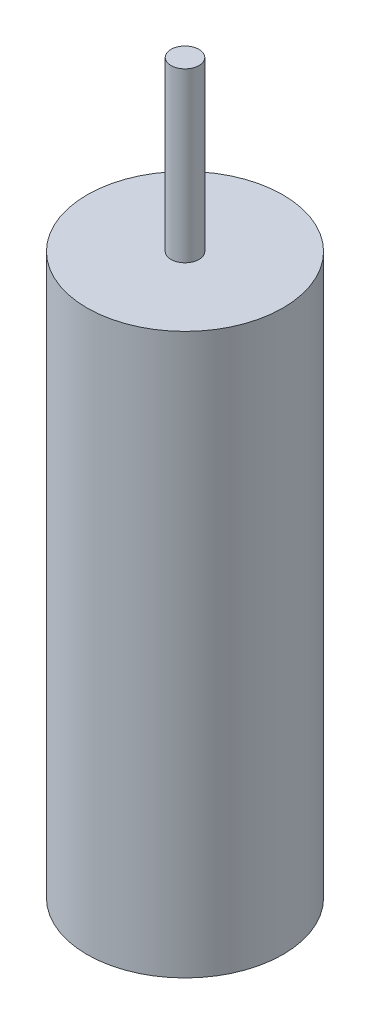
ISO-10303-21;
HEADER;
FILE_DESCRIPTION(('STEP AP214'),'2;1');
FILE_NAME('part.step','',(''),(''),'','','');
FILE_SCHEMA(('AUTOMOTIVE_DESIGN { 1 0 10303 214 1 1 1 1 }'));
ENDSEC;
DATA;
#1=APPLICATION_CONTEXT('core data for automotive mechanical design processes');
#2=APPLICATION_PROTOCOL_DEFINITION('international standard','automotive_design',2000,#1);
#3=PRODUCT_CONTEXT('',#1,'mechanical');
#4=PRODUCT('Part','Part','',(#3));
#5=PRODUCT_RELATED_PRODUCT_CATEGORY('part','',(#4));
#6=PRODUCT_DEFINITION_FORMATION('','',#4);
#7=PRODUCT_DEFINITION_CONTEXT('part definition',#1,'design');
#8=PRODUCT_DEFINITION('design','',#6,#7);
#9=PRODUCT_DEFINITION_SHAPE('','',#8);
#10=(LENGTH_UNIT() NAMED_UNIT(*) SI_UNIT(.MILLI.,.METRE.));
#11=(NAMED_UNIT(*) PLANE_ANGLE_UNIT() SI_UNIT($,.RADIAN.));
#12=(NAMED_UNIT(*) SI_UNIT($,.STERADIAN.) SOLID_ANGLE_UNIT());
#13=UNCERTAINTY_MEASURE_WITH_UNIT(LENGTH_MEASURE(1.E-05),#10,'distance_accuracy_value','');
#14=(GEOMETRIC_REPRESENTATION_CONTEXT(3) GLOBAL_UNCERTAINTY_ASSIGNED_CONTEXT((#13)) GLOBAL_UNIT_ASSIGNED_CONTEXT((#10,
#11,#12)) REPRESENTATION_CONTEXT('',''));
#15=CARTESIAN_POINT('',(0.,0.,0.));
#16=DIRECTION('',(0.,0.,1.));
#17=DIRECTION('',(1.,0.,0.));
#18=AXIS2_PLACEMENT_3D('',#15,#16,#17);
#19=CARTESIAN_POINT('',(0.,20.,0.));
#20=DIRECTION('',(0.,-1.,0.));
#21=DIRECTION('',(0.,0.,-1.));
#22=AXIS2_PLACEMENT_3D('',#19,#20,#21);
#23=CYLINDRICAL_SURFACE('',#22,3.5);
#24=CARTESIAN_POINT('',(0.,20.,0.));
#25=DIRECTION('',(0.,1.,0.));
#26=DIRECTION('',(0.,0.,1.));
#27=AXIS2_PLACEMENT_3D('',#24,#25,#26);
#28=CIRCLE('',#27,3.5);
#29=CARTESIAN_POINT('',(0.,20.,3.5));
#30=VERTEX_POINT('',#29);
#31=EDGE_CURVE('E10',#30,#30,#28,.T.);
#32=ORIENTED_EDGE('',*,*,#31,.F.);
#33=EDGE_LOOP('',(#32));
#34=FACE_BOUND('',#33,.T.);
#35=CARTESIAN_POINT('',(0.,0.,0.));
#36=DIRECTION('',(0.,1.,0.));
#37=DIRECTION('',(0.,0.,1.));
#38=AXIS2_PLACEMENT_3D('',#35,#36,#37);
#39=CIRCLE('',#38,3.5);
#40=CARTESIAN_POINT('',(0.,0.,3.5));
#41=VERTEX_POINT('',#40);
#42=EDGE_CURVE('E34',#41,#41,#39,.T.);
#43=ORIENTED_EDGE('',*,*,#42,.T.);
#44=EDGE_LOOP('',(#43));
#45=FACE_BOUND('',#44,.T.);
#46=ADVANCED_FACE('F31',(#34,#45),#23,.T.);
#47=CARTESIAN_POINT('',(0.,20.,0.));
#48=DIRECTION('',(0.,1.,0.));
#49=DIRECTION('',(0.,0.,1.));
#50=AXIS2_PLACEMENT_3D('',#47,#48,#49);
#51=PLANE('',#50);
#52=CARTESIAN_POINT('',(0.,20.,0.));
#53=DIRECTION('',(0.,1.,0.));
#54=DIRECTION('',(0.,0.,1.));
#55=AXIS2_PLACEMENT_3D('',#52,#53,#54);
#56=CIRCLE('',#55,0.5);
#57=CARTESIAN_POINT('',(0.,20.,0.5));
#58=VERTEX_POINT('',#57);
#59=EDGE_CURVE('E43',#58,#58,#56,.T.);
#60=ORIENTED_EDGE('',*,*,#59,.F.);
#61=EDGE_LOOP('',(#60));
#62=FACE_BOUND('',#61,.T.);
#63=ORIENTED_EDGE('',*,*,#31,.T.);
#64=EDGE_LOOP('',(#63));
#65=FACE_BOUND('',#64,.T.);
#66=ADVANCED_FACE('F58',(#62,#65),#51,.T.);
#67=CARTESIAN_POINT('',(0.,0.,0.));
#68=DIRECTION('',(0.,1.,0.));
#69=DIRECTION('',(0.,0.,1.));
#70=AXIS2_PLACEMENT_3D('',#67,#68,#69);
#71=PLANE('',#70);
#72=ORIENTED_EDGE('',*,*,#42,.F.);
#73=EDGE_LOOP('',(#72));
#74=FACE_BOUND('',#73,.T.);
#75=ADVANCED_FACE('F54',(#74),#71,.F.);
#76=CARTESIAN_POINT('',(0.,26.,0.));
#77=DIRECTION('',(0.,-1.,0.));
#78=DIRECTION('',(0.,0.,-1.));
#79=AXIS2_PLACEMENT_3D('',#76,#77,#78);
#80=CYLINDRICAL_SURFACE('',#79,0.5);
#81=CARTESIAN_POINT('',(0.,26.,0.));
#82=DIRECTION('',(0.,1.,0.));
#83=DIRECTION('',(0.,0.,1.));
#84=AXIS2_PLACEMENT_3D('',#81,#82,#83);
#85=CIRCLE('',#84,0.5);
#86=CARTESIAN_POINT('',(0.,26.,0.5));
#87=VERTEX_POINT('',#86);
#88=EDGE_CURVE('E41',#87,#87,#85,.T.);
#89=ORIENTED_EDGE('',*,*,#88,.F.);
#90=EDGE_LOOP('',(#89));
#91=FACE_BOUND('',#90,.T.);
#92=ORIENTED_EDGE('',*,*,#59,.T.);
#93=EDGE_LOOP('',(#92));
#94=FACE_BOUND('',#93,.T.);
#95=ADVANCED_FACE('F51',(#91,#94),#80,.T.);
#96=CARTESIAN_POINT('',(0.,26.,0.));
#97=DIRECTION('',(0.,1.,0.));
#98=DIRECTION('',(0.,0.,1.));
#99=AXIS2_PLACEMENT_3D('',#96,#97,#98);
#100=PLANE('',#99);
#101=ORIENTED_EDGE('',*,*,#88,.T.);
#102=EDGE_LOOP('',(#101));
#103=FACE_BOUND('',#102,.T.);
#104=ADVANCED_FACE('F49',(#103),#100,.T.);
#105=CLOSED_SHELL('',(#46,#66,#75,#95,#104));
#106=MANIFOLD_SOLID_BREP('B2',#105);
#107=ADVANCED_BREP_SHAPE_REPRESENTATION('',(#18,#106),#14);
#108=SHAPE_DEFINITION_REPRESENTATION(#9,#107);
ENDSEC;
END-ISO-10303-21;
